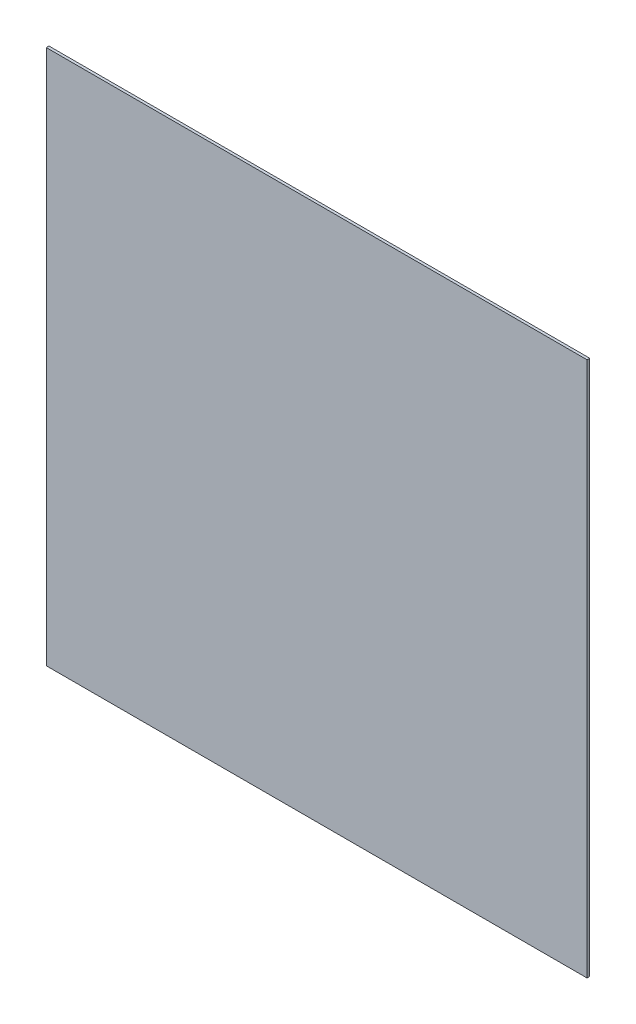
ISO-10303-21;
HEADER;
FILE_DESCRIPTION(('STEP AP214'),'2;1');
FILE_NAME('part.step','',(''),(''),'','','');
FILE_SCHEMA(('AUTOMOTIVE_DESIGN { 1 0 10303 214 1 1 1 1 }'));
ENDSEC;
DATA;
#1=APPLICATION_CONTEXT('core data for automotive mechanical design processes');
#2=APPLICATION_PROTOCOL_DEFINITION('international standard','automotive_design',2000,#1);
#3=PRODUCT_CONTEXT('',#1,'mechanical');
#4=PRODUCT('Part','Part','',(#3));
#5=PRODUCT_RELATED_PRODUCT_CATEGORY('part','',(#4));
#6=PRODUCT_DEFINITION_FORMATION('','',#4);
#7=PRODUCT_DEFINITION_CONTEXT('part definition',#1,'design');
#8=PRODUCT_DEFINITION('design','',#6,#7);
#9=PRODUCT_DEFINITION_SHAPE('','',#8);
#10=(LENGTH_UNIT() NAMED_UNIT(*) SI_UNIT(.MILLI.,.METRE.));
#11=(NAMED_UNIT(*) PLANE_ANGLE_UNIT() SI_UNIT($,.RADIAN.));
#12=(NAMED_UNIT(*) SI_UNIT($,.STERADIAN.) SOLID_ANGLE_UNIT());
#13=UNCERTAINTY_MEASURE_WITH_UNIT(LENGTH_MEASURE(1.E-05),#10,'distance_accuracy_value','');
#14=(GEOMETRIC_REPRESENTATION_CONTEXT(3) GLOBAL_UNCERTAINTY_ASSIGNED_CONTEXT((#13)) GLOBAL_UNIT_ASSIGNED_CONTEXT((#10,
#11,#12)) REPRESENTATION_CONTEXT('',''));
#15=CARTESIAN_POINT('',(0.,0.,0.));
#16=DIRECTION('',(0.,0.,1.));
#17=DIRECTION('',(1.,0.,0.));
#18=AXIS2_PLACEMENT_3D('',#15,#16,#17);
#19=CARTESIAN_POINT('',(-4.9999999999999,-1008.,5.));
#20=DIRECTION('',(1.,0.,0.));
#21=DIRECTION('',(0.,1.,0.));
#22=AXIS2_PLACEMENT_3D('',#19,#20,#21);
#23=PLANE('',#22);
#24=DIRECTION('',(0.,-1.,0.));
#25=VECTOR('',#24,1.);
#26=CARTESIAN_POINT('',(-4.9999999999999,-1008.,0.));
#27=LINE('',#26,#25);
#28=CARTESIAN_POINT('',(-5.,-7.99999999999967,0.));
#29=VERTEX_POINT('',#28);
#30=CARTESIAN_POINT('',(-4.9999999999999,-1008.,0.));
#31=VERTEX_POINT('',#30);
#32=EDGE_CURVE('E94',#29,#31,#27,.T.);
#33=ORIENTED_EDGE('',*,*,#32,.T.);
#34=DIRECTION('',(0.,0.,-1.));
#35=VECTOR('',#34,1.);
#36=CARTESIAN_POINT('',(-4.9999999999999,-1008.,5.));
#37=LINE('',#36,#35);
#38=CARTESIAN_POINT('',(-4.9999999999999,-1008.,5.));
#39=VERTEX_POINT('',#38);
#40=EDGE_CURVE('E11',#39,#31,#37,.T.);
#41=ORIENTED_EDGE('',*,*,#40,.F.);
#42=DIRECTION('',(0.,-1.,0.));
#43=VECTOR('',#42,1.);
#44=CARTESIAN_POINT('',(-4.9999999999999,-1008.,5.));
#45=LINE('',#44,#43);
#46=CARTESIAN_POINT('',(-5.,-7.99999999999967,5.));
#47=VERTEX_POINT('',#46);
#48=EDGE_CURVE('E82',#47,#39,#45,.T.);
#49=ORIENTED_EDGE('',*,*,#48,.F.);
#50=DIRECTION('',(0.,0.,-1.));
#51=VECTOR('',#50,1.);
#52=CARTESIAN_POINT('',(-5.,-7.99999999999967,5.));
#53=LINE('',#52,#51);
#54=EDGE_CURVE('E90',#47,#29,#53,.T.);
#55=ORIENTED_EDGE('',*,*,#54,.T.);
#56=EDGE_LOOP('',(#33,#41,#49,#55));
#57=FACE_BOUND('',#56,.T.);
#58=ADVANCED_FACE('F31',(#57),#23,.F.);
#59=CARTESIAN_POINT('',(1005.,-1008.,5.));
#60=DIRECTION('',(0.,1.,0.));
#61=DIRECTION('',(-1.,0.,0.));
#62=AXIS2_PLACEMENT_3D('',#59,#60,#61);
#63=PLANE('',#62);
#64=DIRECTION('',(1.,0.,0.));
#65=VECTOR('',#64,1.);
#66=CARTESIAN_POINT('',(1005.,-1008.,0.));
#67=LINE('',#66,#65);
#68=CARTESIAN_POINT('',(1005.,-1008.,0.));
#69=VERTEX_POINT('',#68);
#70=EDGE_CURVE('E86',#31,#69,#67,.T.);
#71=ORIENTED_EDGE('',*,*,#70,.T.);
#72=DIRECTION('',(0.,0.,-1.));
#73=VECTOR('',#72,1.);
#74=CARTESIAN_POINT('',(1005.,-1008.,5.));
#75=LINE('',#74,#73);
#76=CARTESIAN_POINT('',(1005.,-1008.,5.));
#77=VERTEX_POINT('',#76);
#78=EDGE_CURVE('E39',#77,#69,#75,.T.);
#79=ORIENTED_EDGE('',*,*,#78,.F.);
#80=DIRECTION('',(1.,0.,0.));
#81=VECTOR('',#80,1.);
#82=CARTESIAN_POINT('',(1005.,-1008.,5.));
#83=LINE('',#82,#81);
#84=EDGE_CURVE('E77',#39,#77,#83,.T.);
#85=ORIENTED_EDGE('',*,*,#84,.F.);
#86=ORIENTED_EDGE('',*,*,#40,.T.);
#87=EDGE_LOOP('',(#71,#79,#85,#86));
#88=FACE_BOUND('',#87,.T.);
#89=ADVANCED_FACE('F85',(#88),#63,.F.);
#90=CARTESIAN_POINT('',(1005.,-1008.,5.));
#91=DIRECTION('',(-1.,0.,0.));
#92=DIRECTION('',(0.,0.,1.));
#93=AXIS2_PLACEMENT_3D('',#90,#91,#92);
#94=PLANE('',#93);
#95=DIRECTION('',(0.,1.,0.));
#96=VECTOR('',#95,1.);
#97=CARTESIAN_POINT('',(1005.,-1008.,0.));
#98=LINE('',#97,#96);
#99=CARTESIAN_POINT('',(1005.,-7.99999999999955,0.));
#100=VERTEX_POINT('',#99);
#101=EDGE_CURVE('E64',#69,#100,#98,.T.);
#102=ORIENTED_EDGE('',*,*,#101,.T.);
#103=DIRECTION('',(0.,0.,-1.));
#104=VECTOR('',#103,1.);
#105=CARTESIAN_POINT('',(1005.,-7.99999999999955,5.));
#106=LINE('',#105,#104);
#107=CARTESIAN_POINT('',(1005.,-7.99999999999955,5.));
#108=VERTEX_POINT('',#107);
#109=EDGE_CURVE('E87',#108,#100,#106,.T.);
#110=ORIENTED_EDGE('',*,*,#109,.F.);
#111=DIRECTION('',(0.,1.,0.));
#112=VECTOR('',#111,1.);
#113=CARTESIAN_POINT('',(1005.,-1008.,5.));
#114=LINE('',#113,#112);
#115=EDGE_CURVE('E80',#77,#108,#114,.T.);
#116=ORIENTED_EDGE('',*,*,#115,.F.);
#117=ORIENTED_EDGE('',*,*,#78,.T.);
#118=EDGE_LOOP('',(#102,#110,#116,#117));
#119=FACE_BOUND('',#118,.T.);
#120=ADVANCED_FACE('F88',(#119),#94,.F.);
#121=CARTESIAN_POINT('',(1005.,-7.99999999999955,5.));
#122=DIRECTION('',(0.,-1.,0.));
#123=DIRECTION('',(1.,0.,0.));
#124=AXIS2_PLACEMENT_3D('',#121,#122,#123);
#125=PLANE('',#124);
#126=DIRECTION('',(-1.,0.,0.));
#127=VECTOR('',#126,1.);
#128=CARTESIAN_POINT('',(1005.,-7.99999999999955,0.));
#129=LINE('',#128,#127);
#130=EDGE_CURVE('E70',#100,#29,#129,.T.);
#131=ORIENTED_EDGE('',*,*,#130,.T.);
#132=ORIENTED_EDGE('',*,*,#54,.F.);
#133=DIRECTION('',(-1.,0.,0.));
#134=VECTOR('',#133,1.);
#135=CARTESIAN_POINT('',(1005.,-7.99999999999955,5.));
#136=LINE('',#135,#134);
#137=EDGE_CURVE('E47',#108,#47,#136,.T.);
#138=ORIENTED_EDGE('',*,*,#137,.F.);
#139=ORIENTED_EDGE('',*,*,#109,.T.);
#140=EDGE_LOOP('',(#131,#132,#138,#139));
#141=FACE_BOUND('',#140,.T.);
#142=ADVANCED_FACE('F101',(#141),#125,.F.);
#143=CARTESIAN_POINT('',(-4.99999999999989,-7.99999999999967,5.));
#144=DIRECTION('',(0.,0.,1.));
#145=DIRECTION('',(1.,0.,0.));
#146=AXIS2_PLACEMENT_3D('',#143,#144,#145);
#147=PLANE('',#146);
#148=ORIENTED_EDGE('',*,*,#48,.T.);
#149=ORIENTED_EDGE('',*,*,#84,.T.);
#150=ORIENTED_EDGE('',*,*,#115,.T.);
#151=ORIENTED_EDGE('',*,*,#137,.T.);
#152=EDGE_LOOP('',(#148,#149,#150,#151));
#153=FACE_BOUND('',#152,.T.);
#154=ADVANCED_FACE('F78',(#153),#147,.T.);
#155=CARTESIAN_POINT('',(-4.99999999999989,-7.99999999999967,0.));
#156=DIRECTION('',(0.,0.,1.));
#157=DIRECTION('',(1.,0.,0.));
#158=AXIS2_PLACEMENT_3D('',#155,#156,#157);
#159=PLANE('',#158);
#160=ORIENTED_EDGE('',*,*,#32,.F.);
#161=ORIENTED_EDGE('',*,*,#130,.F.);
#162=ORIENTED_EDGE('',*,*,#101,.F.);
#163=ORIENTED_EDGE('',*,*,#70,.F.);
#164=EDGE_LOOP('',(#160,#161,#162,#163));
#165=FACE_BOUND('',#164,.T.);
#166=ADVANCED_FACE('F104',(#165),#159,.F.);
#167=CLOSED_SHELL('',(#58,#89,#120,#142,#154,#166));
#168=MANIFOLD_SOLID_BREP('B2',#167);
#169=ADVANCED_BREP_SHAPE_REPRESENTATION('',(#18,#168),#14);
#170=SHAPE_DEFINITION_REPRESENTATION(#9,#169);
ENDSEC;
END-ISO-10303-21;
